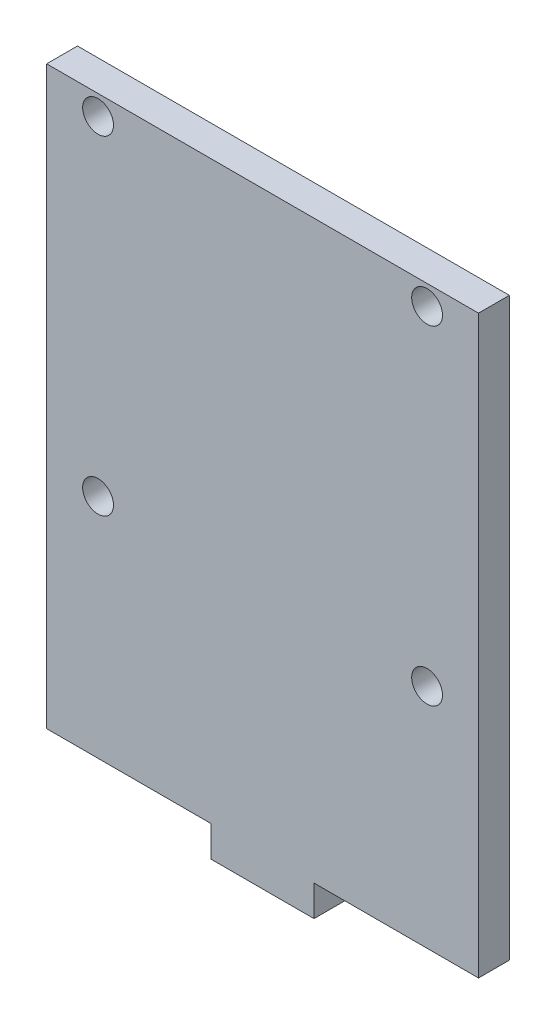
ISO-10303-21;
HEADER;
FILE_DESCRIPTION(('STEP AP214'),'2;1');
FILE_NAME('part.step','',(''),(''),'','','');
FILE_SCHEMA(('AUTOMOTIVE_DESIGN { 1 0 10303 214 1 1 1 1 }'));
ENDSEC;
DATA;
#1=APPLICATION_CONTEXT('core data for automotive mechanical design processes');
#2=APPLICATION_PROTOCOL_DEFINITION('international standard','automotive_design',2000,#1);
#3=PRODUCT_CONTEXT('',#1,'mechanical');
#4=PRODUCT('Part','Part','',(#3));
#5=PRODUCT_RELATED_PRODUCT_CATEGORY('part','',(#4));
#6=PRODUCT_DEFINITION_FORMATION('','',#4);
#7=PRODUCT_DEFINITION_CONTEXT('part definition',#1,'design');
#8=PRODUCT_DEFINITION('design','',#6,#7);
#9=PRODUCT_DEFINITION_SHAPE('','',#8);
#10=(LENGTH_UNIT() NAMED_UNIT(*) SI_UNIT(.MILLI.,.METRE.));
#11=(NAMED_UNIT(*) PLANE_ANGLE_UNIT() SI_UNIT($,.RADIAN.));
#12=(NAMED_UNIT(*) SI_UNIT($,.STERADIAN.) SOLID_ANGLE_UNIT());
#13=UNCERTAINTY_MEASURE_WITH_UNIT(LENGTH_MEASURE(1.E-05),#10,'distance_accuracy_value','');
#14=(GEOMETRIC_REPRESENTATION_CONTEXT(3) GLOBAL_UNCERTAINTY_ASSIGNED_CONTEXT((#13)) GLOBAL_UNIT_ASSIGNED_CONTEXT((#10,
#11,#12)) REPRESENTATION_CONTEXT('',''));
#15=CARTESIAN_POINT('',(0.,0.,0.));
#16=DIRECTION('',(0.,0.,1.));
#17=DIRECTION('',(1.,0.,0.));
#18=AXIS2_PLACEMENT_3D('',#15,#16,#17);
#19=CARTESIAN_POINT('',(0.,0.,3.));
#20=DIRECTION('',(0.,0.,1.));
#21=DIRECTION('',(1.,0.,0.));
#22=AXIS2_PLACEMENT_3D('',#19,#20,#21);
#23=PLANE('',#22);
#24=CARTESIAN_POINT('',(16.,-4.43081098795182,3.));
#25=DIRECTION('',(0.,0.,1.));
#26=DIRECTION('',(1.,0.,0.));
#27=AXIS2_PLACEMENT_3D('',#24,#25,#26);
#28=CIRCLE('',#27,1.5);
#29=CARTESIAN_POINT('',(17.5,-4.43081098795182,3.));
#30=VERTEX_POINT('',#29);
#31=EDGE_CURVE('E221',#30,#30,#28,.T.);
#32=ORIENTED_EDGE('',*,*,#31,.F.);
#33=EDGE_LOOP('',(#32));
#34=FACE_BOUND('',#33,.T.);
#35=CARTESIAN_POINT('',(-16.,27.5691890120482,3.));
#36=DIRECTION('',(0.,0.,1.));
#37=DIRECTION('',(1.,0.,0.));
#38=AXIS2_PLACEMENT_3D('',#35,#36,#37);
#39=CIRCLE('',#38,1.5);
#40=CARTESIAN_POINT('',(-14.5,27.5691890120482,3.));
#41=VERTEX_POINT('',#40);
#42=EDGE_CURVE('E146',#41,#41,#39,.T.);
#43=ORIENTED_EDGE('',*,*,#42,.F.);
#44=EDGE_LOOP('',(#43));
#45=FACE_BOUND('',#44,.T.);
#46=DIRECTION('',(0.,-1.,0.));
#47=VECTOR('',#46,1.);
#48=CARTESIAN_POINT('',(-21.,-26.5,3.));
#49=LINE('',#48,#47);
#50=CARTESIAN_POINT('',(-21.,29.5,3.));
#51=VERTEX_POINT('',#50);
#52=CARTESIAN_POINT('',(-21.,-26.5,3.));
#53=VERTEX_POINT('',#52);
#54=EDGE_CURVE('E164',#51,#53,#49,.T.);
#55=ORIENTED_EDGE('',*,*,#54,.T.);
#56=DIRECTION('',(1.,0.,0.));
#57=VECTOR('',#56,1.);
#58=CARTESIAN_POINT('',(-21.,-26.5,3.));
#59=LINE('',#58,#57);
#60=CARTESIAN_POINT('',(-5.,-26.5,3.));
#61=VERTEX_POINT('',#60);
#62=EDGE_CURVE('E100',#53,#61,#59,.T.);
#63=ORIENTED_EDGE('',*,*,#62,.T.);
#64=DIRECTION('',(0.,-1.,0.));
#65=VECTOR('',#64,1.);
#66=CARTESIAN_POINT('',(-5.,-29.5,3.));
#67=LINE('',#66,#65);
#68=CARTESIAN_POINT('',(-5.,-29.5,3.));
#69=VERTEX_POINT('',#68);
#70=EDGE_CURVE('E185',#61,#69,#67,.T.);
#71=ORIENTED_EDGE('',*,*,#70,.T.);
#72=DIRECTION('',(1.,0.,0.));
#73=VECTOR('',#72,1.);
#74=CARTESIAN_POINT('',(5.00000000000001,-29.5,3.));
#75=LINE('',#74,#73);
#76=CARTESIAN_POINT('',(5.00000000000001,-29.5,3.));
#77=VERTEX_POINT('',#76);
#78=EDGE_CURVE('E199',#69,#77,#75,.T.);
#79=ORIENTED_EDGE('',*,*,#78,.T.);
#80=DIRECTION('',(0.,1.,0.));
#81=VECTOR('',#80,1.);
#82=CARTESIAN_POINT('',(5.00000000000001,-26.5,3.));
#83=LINE('',#82,#81);
#84=CARTESIAN_POINT('',(5.00000000000001,-26.5,3.));
#85=VERTEX_POINT('',#84);
#86=EDGE_CURVE('E119',#77,#85,#83,.T.);
#87=ORIENTED_EDGE('',*,*,#86,.T.);
#88=DIRECTION('',(1.,0.,0.));
#89=VECTOR('',#88,1.);
#90=CARTESIAN_POINT('',(5.00000000000001,-26.5,3.));
#91=LINE('',#90,#89);
#92=CARTESIAN_POINT('',(21.,-26.5,3.));
#93=VERTEX_POINT('',#92);
#94=EDGE_CURVE('E113',#85,#93,#91,.T.);
#95=ORIENTED_EDGE('',*,*,#94,.T.);
#96=DIRECTION('',(0.,1.,0.));
#97=VECTOR('',#96,1.);
#98=CARTESIAN_POINT('',(21.,-26.5,3.));
#99=LINE('',#98,#97);
#100=CARTESIAN_POINT('',(21.,29.5,3.));
#101=VERTEX_POINT('',#100);
#102=EDGE_CURVE('E117',#93,#101,#99,.T.);
#103=ORIENTED_EDGE('',*,*,#102,.T.);
#104=DIRECTION('',(-1.,0.,0.));
#105=VECTOR('',#104,1.);
#106=CARTESIAN_POINT('',(21.,29.5,3.));
#107=LINE('',#106,#105);
#108=EDGE_CURVE('E57',#101,#51,#107,.T.);
#109=ORIENTED_EDGE('',*,*,#108,.T.);
#110=EDGE_LOOP('',(#55,#63,#71,#79,#87,#95,#103,#109));
#111=FACE_BOUND('',#110,.T.);
#112=CARTESIAN_POINT('',(-16.,-4.43081098795182,3.));
#113=DIRECTION('',(0.,0.,1.));
#114=DIRECTION('',(1.,0.,0.));
#115=AXIS2_PLACEMENT_3D('',#112,#113,#114);
#116=CIRCLE('',#115,1.5);
#117=CARTESIAN_POINT('',(-14.5,-4.43081098795182,3.));
#118=VERTEX_POINT('',#117);
#119=EDGE_CURVE('E213',#118,#118,#116,.T.);
#120=ORIENTED_EDGE('',*,*,#119,.F.);
#121=EDGE_LOOP('',(#120));
#122=FACE_BOUND('',#121,.T.);
#123=CARTESIAN_POINT('',(16.,27.5691890120482,3.));
#124=DIRECTION('',(0.,0.,1.));
#125=DIRECTION('',(1.,0.,0.));
#126=AXIS2_PLACEMENT_3D('',#123,#124,#125);
#127=CIRCLE('',#126,1.5);
#128=CARTESIAN_POINT('',(17.5,27.5691890120482,3.));
#129=VERTEX_POINT('',#128);
#130=EDGE_CURVE('E229',#129,#129,#127,.T.);
#131=ORIENTED_EDGE('',*,*,#130,.F.);
#132=EDGE_LOOP('',(#131));
#133=FACE_BOUND('',#132,.T.);
#134=ADVANCED_FACE('F39',(#34,#45,#111,#122,#133),#23,.T.);
#135=CARTESIAN_POINT('',(0.,0.,0.));
#136=DIRECTION('',(0.,0.,1.));
#137=DIRECTION('',(1.,0.,0.));
#138=AXIS2_PLACEMENT_3D('',#135,#136,#137);
#139=PLANE('',#138);
#140=DIRECTION('',(0.,-1.,0.));
#141=VECTOR('',#140,1.);
#142=CARTESIAN_POINT('',(-21.,-26.5,0.));
#143=LINE('',#142,#141);
#144=CARTESIAN_POINT('',(-21.,29.5,0.));
#145=VERTEX_POINT('',#144);
#146=CARTESIAN_POINT('',(-21.,-26.5,0.));
#147=VERTEX_POINT('',#146);
#148=EDGE_CURVE('E141',#145,#147,#143,.T.);
#149=ORIENTED_EDGE('',*,*,#148,.F.);
#150=DIRECTION('',(-1.,0.,0.));
#151=VECTOR('',#150,1.);
#152=CARTESIAN_POINT('',(21.,29.5,0.));
#153=LINE('',#152,#151);
#154=CARTESIAN_POINT('',(21.,29.5,0.));
#155=VERTEX_POINT('',#154);
#156=EDGE_CURVE('E92',#155,#145,#153,.T.);
#157=ORIENTED_EDGE('',*,*,#156,.F.);
#158=DIRECTION('',(0.,1.,0.));
#159=VECTOR('',#158,1.);
#160=CARTESIAN_POINT('',(21.,-26.5,0.));
#161=LINE('',#160,#159);
#162=CARTESIAN_POINT('',(21.,-26.5,0.));
#163=VERTEX_POINT('',#162);
#164=EDGE_CURVE('E86',#163,#155,#161,.T.);
#165=ORIENTED_EDGE('',*,*,#164,.F.);
#166=DIRECTION('',(1.,0.,0.));
#167=VECTOR('',#166,1.);
#168=CARTESIAN_POINT('',(5.00000000000001,-26.5,0.));
#169=LINE('',#168,#167);
#170=CARTESIAN_POINT('',(5.00000000000001,-26.5,0.));
#171=VERTEX_POINT('',#170);
#172=EDGE_CURVE('E128',#171,#163,#169,.T.);
#173=ORIENTED_EDGE('',*,*,#172,.F.);
#174=DIRECTION('',(0.,1.,0.));
#175=VECTOR('',#174,1.);
#176=CARTESIAN_POINT('',(5.00000000000001,-26.5,0.));
#177=LINE('',#176,#175);
#178=CARTESIAN_POINT('',(5.00000000000001,-29.5,0.));
#179=VERTEX_POINT('',#178);
#180=EDGE_CURVE('E155',#179,#171,#177,.T.);
#181=ORIENTED_EDGE('',*,*,#180,.F.);
#182=DIRECTION('',(1.,0.,0.));
#183=VECTOR('',#182,1.);
#184=CARTESIAN_POINT('',(5.00000000000001,-29.5,0.));
#185=LINE('',#184,#183);
#186=CARTESIAN_POINT('',(-5.,-29.5,0.));
#187=VERTEX_POINT('',#186);
#188=EDGE_CURVE('E152',#187,#179,#185,.T.);
#189=ORIENTED_EDGE('',*,*,#188,.F.);
#190=DIRECTION('',(0.,-1.,0.));
#191=VECTOR('',#190,1.);
#192=CARTESIAN_POINT('',(-5.,-29.5,0.));
#193=LINE('',#192,#191);
#194=CARTESIAN_POINT('',(-5.,-26.5,0.));
#195=VERTEX_POINT('',#194);
#196=EDGE_CURVE('E149',#195,#187,#193,.T.);
#197=ORIENTED_EDGE('',*,*,#196,.F.);
#198=DIRECTION('',(1.,0.,0.));
#199=VECTOR('',#198,1.);
#200=CARTESIAN_POINT('',(-21.,-26.5,0.));
#201=LINE('',#200,#199);
#202=EDGE_CURVE('E145',#147,#195,#201,.T.);
#203=ORIENTED_EDGE('',*,*,#202,.F.);
#204=EDGE_LOOP('',(#149,#157,#165,#173,#181,#189,#197,#203));
#205=FACE_BOUND('',#204,.T.);
#206=CARTESIAN_POINT('',(-16.,27.5691890120482,0.));
#207=DIRECTION('',(0.,0.,1.));
#208=DIRECTION('',(1.,0.,0.));
#209=AXIS2_PLACEMENT_3D('',#206,#207,#208);
#210=CIRCLE('',#209,1.5);
#211=CARTESIAN_POINT('',(-14.5,27.5691890120482,0.));
#212=VERTEX_POINT('',#211);
#213=EDGE_CURVE('E209',#212,#212,#210,.T.);
#214=ORIENTED_EDGE('',*,*,#213,.T.);
#215=EDGE_LOOP('',(#214));
#216=FACE_BOUND('',#215,.T.);
#217=CARTESIAN_POINT('',(-16.,-4.43081098795182,0.));
#218=DIRECTION('',(0.,0.,1.));
#219=DIRECTION('',(1.,0.,0.));
#220=AXIS2_PLACEMENT_3D('',#217,#218,#219);
#221=CIRCLE('',#220,1.5);
#222=CARTESIAN_POINT('',(-14.5,-4.43081098795182,0.));
#223=VERTEX_POINT('',#222);
#224=EDGE_CURVE('E217',#223,#223,#221,.T.);
#225=ORIENTED_EDGE('',*,*,#224,.T.);
#226=EDGE_LOOP('',(#225));
#227=FACE_BOUND('',#226,.T.);
#228=CARTESIAN_POINT('',(16.,-4.43081098795182,0.));
#229=DIRECTION('',(0.,0.,1.));
#230=DIRECTION('',(1.,0.,0.));
#231=AXIS2_PLACEMENT_3D('',#228,#229,#230);
#232=CIRCLE('',#231,1.5);
#233=CARTESIAN_POINT('',(17.5,-4.43081098795182,0.));
#234=VERTEX_POINT('',#233);
#235=EDGE_CURVE('E225',#234,#234,#232,.T.);
#236=ORIENTED_EDGE('',*,*,#235,.T.);
#237=EDGE_LOOP('',(#236));
#238=FACE_BOUND('',#237,.T.);
#239=CARTESIAN_POINT('',(16.,27.5691890120482,0.));
#240=DIRECTION('',(0.,0.,1.));
#241=DIRECTION('',(1.,0.,0.));
#242=AXIS2_PLACEMENT_3D('',#239,#240,#241);
#243=CIRCLE('',#242,1.5);
#244=CARTESIAN_POINT('',(17.5,27.5691890120482,0.));
#245=VERTEX_POINT('',#244);
#246=EDGE_CURVE('E233',#245,#245,#243,.T.);
#247=ORIENTED_EDGE('',*,*,#246,.T.);
#248=EDGE_LOOP('',(#247));
#249=FACE_BOUND('',#248,.T.);
#250=ADVANCED_FACE('F189',(#205,#216,#227,#238,#249),#139,.F.);
#251=CARTESIAN_POINT('',(-21.,-26.5,3.));
#252=DIRECTION('',(1.,0.,0.));
#253=DIRECTION('',(0.,0.,-1.));
#254=AXIS2_PLACEMENT_3D('',#251,#252,#253);
#255=PLANE('',#254);
#256=ORIENTED_EDGE('',*,*,#148,.T.);
#257=DIRECTION('',(0.,0.,-1.));
#258=VECTOR('',#257,1.);
#259=CARTESIAN_POINT('',(-21.,-26.5,3.));
#260=LINE('',#259,#258);
#261=EDGE_CURVE('E11',#53,#147,#260,.T.);
#262=ORIENTED_EDGE('',*,*,#261,.F.);
#263=ORIENTED_EDGE('',*,*,#54,.F.);
#264=DIRECTION('',(0.,0.,-1.));
#265=VECTOR('',#264,1.);
#266=CARTESIAN_POINT('',(-21.,29.5,3.));
#267=LINE('',#266,#265);
#268=EDGE_CURVE('E137',#51,#145,#267,.T.);
#269=ORIENTED_EDGE('',*,*,#268,.T.);
#270=EDGE_LOOP('',(#256,#262,#263,#269));
#271=FACE_BOUND('',#270,.T.);
#272=ADVANCED_FACE('F41',(#271),#255,.F.);
#273=CARTESIAN_POINT('',(-21.,-26.5,3.));
#274=DIRECTION('',(0.,1.,0.));
#275=DIRECTION('',(0.,0.,1.));
#276=AXIS2_PLACEMENT_3D('',#273,#274,#275);
#277=PLANE('',#276);
#278=ORIENTED_EDGE('',*,*,#202,.T.);
#279=DIRECTION('',(0.,0.,-1.));
#280=VECTOR('',#279,1.);
#281=CARTESIAN_POINT('',(-5.,-26.5,3.));
#282=LINE('',#281,#280);
#283=EDGE_CURVE('E49',#61,#195,#282,.T.);
#284=ORIENTED_EDGE('',*,*,#283,.F.);
#285=ORIENTED_EDGE('',*,*,#62,.F.);
#286=ORIENTED_EDGE('',*,*,#261,.T.);
#287=EDGE_LOOP('',(#278,#284,#285,#286));
#288=FACE_BOUND('',#287,.T.);
#289=ADVANCED_FACE('F269',(#288),#277,.F.);
#290=CARTESIAN_POINT('',(-5.,-29.5,3.));
#291=DIRECTION('',(1.,0.,0.));
#292=DIRECTION('',(0.,0.,-1.));
#293=AXIS2_PLACEMENT_3D('',#290,#291,#292);
#294=PLANE('',#293);
#295=ORIENTED_EDGE('',*,*,#196,.T.);
#296=DIRECTION('',(0.,0.,-1.));
#297=VECTOR('',#296,1.);
#298=CARTESIAN_POINT('',(-5.,-29.5,3.));
#299=LINE('',#298,#297);
#300=EDGE_CURVE('E175',#69,#187,#299,.T.);
#301=ORIENTED_EDGE('',*,*,#300,.F.);
#302=ORIENTED_EDGE('',*,*,#70,.F.);
#303=ORIENTED_EDGE('',*,*,#283,.T.);
#304=EDGE_LOOP('',(#295,#301,#302,#303));
#305=FACE_BOUND('',#304,.T.);
#306=ADVANCED_FACE('F183',(#305),#294,.F.);
#307=CARTESIAN_POINT('',(5.00000000000001,-29.5,3.));
#308=DIRECTION('',(0.,1.,0.));
#309=DIRECTION('',(0.,0.,1.));
#310=AXIS2_PLACEMENT_3D('',#307,#308,#309);
#311=PLANE('',#310);
#312=ORIENTED_EDGE('',*,*,#188,.T.);
#313=DIRECTION('',(0.,0.,-1.));
#314=VECTOR('',#313,1.);
#315=CARTESIAN_POINT('',(5.00000000000001,-29.5,3.));
#316=LINE('',#315,#314);
#317=EDGE_CURVE('E171',#77,#179,#316,.T.);
#318=ORIENTED_EDGE('',*,*,#317,.F.);
#319=ORIENTED_EDGE('',*,*,#78,.F.);
#320=ORIENTED_EDGE('',*,*,#300,.T.);
#321=EDGE_LOOP('',(#312,#318,#319,#320));
#322=FACE_BOUND('',#321,.T.);
#323=ADVANCED_FACE('F194',(#322),#311,.F.);
#324=CARTESIAN_POINT('',(5.00000000000001,-26.5,3.));
#325=DIRECTION('',(-1.,0.,0.));
#326=DIRECTION('',(0.,-1.,0.));
#327=AXIS2_PLACEMENT_3D('',#324,#325,#326);
#328=PLANE('',#327);
#329=ORIENTED_EDGE('',*,*,#180,.T.);
#330=DIRECTION('',(0.,0.,-1.));
#331=VECTOR('',#330,1.);
#332=CARTESIAN_POINT('',(5.00000000000001,-26.5,3.));
#333=LINE('',#332,#331);
#334=EDGE_CURVE('E130',#85,#171,#333,.T.);
#335=ORIENTED_EDGE('',*,*,#334,.F.);
#336=ORIENTED_EDGE('',*,*,#86,.F.);
#337=ORIENTED_EDGE('',*,*,#317,.T.);
#338=EDGE_LOOP('',(#329,#335,#336,#337));
#339=FACE_BOUND('',#338,.T.);
#340=ADVANCED_FACE('F197',(#339),#328,.F.);
#341=CARTESIAN_POINT('',(5.00000000000001,-26.5,3.));
#342=DIRECTION('',(0.,1.,0.));
#343=DIRECTION('',(0.,0.,1.));
#344=AXIS2_PLACEMENT_3D('',#341,#342,#343);
#345=PLANE('',#344);
#346=ORIENTED_EDGE('',*,*,#172,.T.);
#347=DIRECTION('',(0.,0.,-1.));
#348=VECTOR('',#347,1.);
#349=CARTESIAN_POINT('',(21.,-26.5,3.));
#350=LINE('',#349,#348);
#351=EDGE_CURVE('E125',#93,#163,#350,.T.);
#352=ORIENTED_EDGE('',*,*,#351,.F.);
#353=ORIENTED_EDGE('',*,*,#94,.F.);
#354=ORIENTED_EDGE('',*,*,#334,.T.);
#355=EDGE_LOOP('',(#346,#352,#353,#354));
#356=FACE_BOUND('',#355,.T.);
#357=ADVANCED_FACE('F126',(#356),#345,.F.);
#358=CARTESIAN_POINT('',(21.,-26.5,3.));
#359=DIRECTION('',(-1.,0.,0.));
#360=DIRECTION('',(0.,0.,1.));
#361=AXIS2_PLACEMENT_3D('',#358,#359,#360);
#362=PLANE('',#361);
#363=ORIENTED_EDGE('',*,*,#164,.T.);
#364=DIRECTION('',(0.,0.,-1.));
#365=VECTOR('',#364,1.);
#366=CARTESIAN_POINT('',(21.,29.5,3.));
#367=LINE('',#366,#365);
#368=EDGE_CURVE('E131',#101,#155,#367,.T.);
#369=ORIENTED_EDGE('',*,*,#368,.F.);
#370=ORIENTED_EDGE('',*,*,#102,.F.);
#371=ORIENTED_EDGE('',*,*,#351,.T.);
#372=EDGE_LOOP('',(#363,#369,#370,#371));
#373=FACE_BOUND('',#372,.T.);
#374=ADVANCED_FACE('F133',(#373),#362,.F.);
#375=CARTESIAN_POINT('',(21.,29.5,3.));
#376=DIRECTION('',(0.,-1.,0.));
#377=DIRECTION('',(1.,0.,0.));
#378=AXIS2_PLACEMENT_3D('',#375,#376,#377);
#379=PLANE('',#378);
#380=ORIENTED_EDGE('',*,*,#156,.T.);
#381=ORIENTED_EDGE('',*,*,#268,.F.);
#382=ORIENTED_EDGE('',*,*,#108,.F.);
#383=ORIENTED_EDGE('',*,*,#368,.T.);
#384=EDGE_LOOP('',(#380,#381,#382,#383));
#385=FACE_BOUND('',#384,.T.);
#386=ADVANCED_FACE('F257',(#385),#379,.F.);
#387=CARTESIAN_POINT('',(-16.,27.5691890120482,3.));
#388=DIRECTION('',(0.,0.,-1.));
#389=DIRECTION('',(-1.,0.,0.));
#390=AXIS2_PLACEMENT_3D('',#387,#388,#389);
#391=CYLINDRICAL_SURFACE('',#390,1.5);
#392=ORIENTED_EDGE('',*,*,#42,.T.);
#393=EDGE_LOOP('',(#392));
#394=FACE_BOUND('',#393,.T.);
#395=ORIENTED_EDGE('',*,*,#213,.F.);
#396=EDGE_LOOP('',(#395));
#397=FACE_BOUND('',#396,.T.);
#398=ADVANCED_FACE('F254',(#394,#397),#391,.F.);
#399=CARTESIAN_POINT('',(-16.,-4.43081098795182,3.));
#400=DIRECTION('',(0.,0.,-1.));
#401=DIRECTION('',(-1.,0.,0.));
#402=AXIS2_PLACEMENT_3D('',#399,#400,#401);
#403=CYLINDRICAL_SURFACE('',#402,1.5);
#404=ORIENTED_EDGE('',*,*,#119,.T.);
#405=EDGE_LOOP('',(#404));
#406=FACE_BOUND('',#405,.T.);
#407=ORIENTED_EDGE('',*,*,#224,.F.);
#408=EDGE_LOOP('',(#407));
#409=FACE_BOUND('',#408,.T.);
#410=ADVANCED_FACE('F333',(#406,#409),#403,.F.);
#411=CARTESIAN_POINT('',(16.,-4.43081098795182,3.));
#412=DIRECTION('',(0.,0.,-1.));
#413=DIRECTION('',(-1.,0.,0.));
#414=AXIS2_PLACEMENT_3D('',#411,#412,#413);
#415=CYLINDRICAL_SURFACE('',#414,1.5);
#416=ORIENTED_EDGE('',*,*,#31,.T.);
#417=EDGE_LOOP('',(#416));
#418=FACE_BOUND('',#417,.T.);
#419=ORIENTED_EDGE('',*,*,#235,.F.);
#420=EDGE_LOOP('',(#419));
#421=FACE_BOUND('',#420,.T.);
#422=ADVANCED_FACE('F341',(#418,#421),#415,.F.);
#423=CARTESIAN_POINT('',(16.,27.5691890120482,3.));
#424=DIRECTION('',(0.,0.,-1.));
#425=DIRECTION('',(-1.,0.,0.));
#426=AXIS2_PLACEMENT_3D('',#423,#424,#425);
#427=CYLINDRICAL_SURFACE('',#426,1.5);
#428=ORIENTED_EDGE('',*,*,#130,.T.);
#429=EDGE_LOOP('',(#428));
#430=FACE_BOUND('',#429,.T.);
#431=ORIENTED_EDGE('',*,*,#246,.F.);
#432=EDGE_LOOP('',(#431));
#433=FACE_BOUND('',#432,.T.);
#434=ADVANCED_FACE('F241',(#430,#433),#427,.F.);
#435=CLOSED_SHELL('',(#134,#250,#272,#289,#306,#323,#340,#357,#374,#386,#398,#410,#422,#434));
#436=MANIFOLD_SOLID_BREP('B2',#435);
#437=ADVANCED_BREP_SHAPE_REPRESENTATION('',(#18,#436),#14);
#438=SHAPE_DEFINITION_REPRESENTATION(#9,#437);
ENDSEC;
END-ISO-10303-21;
